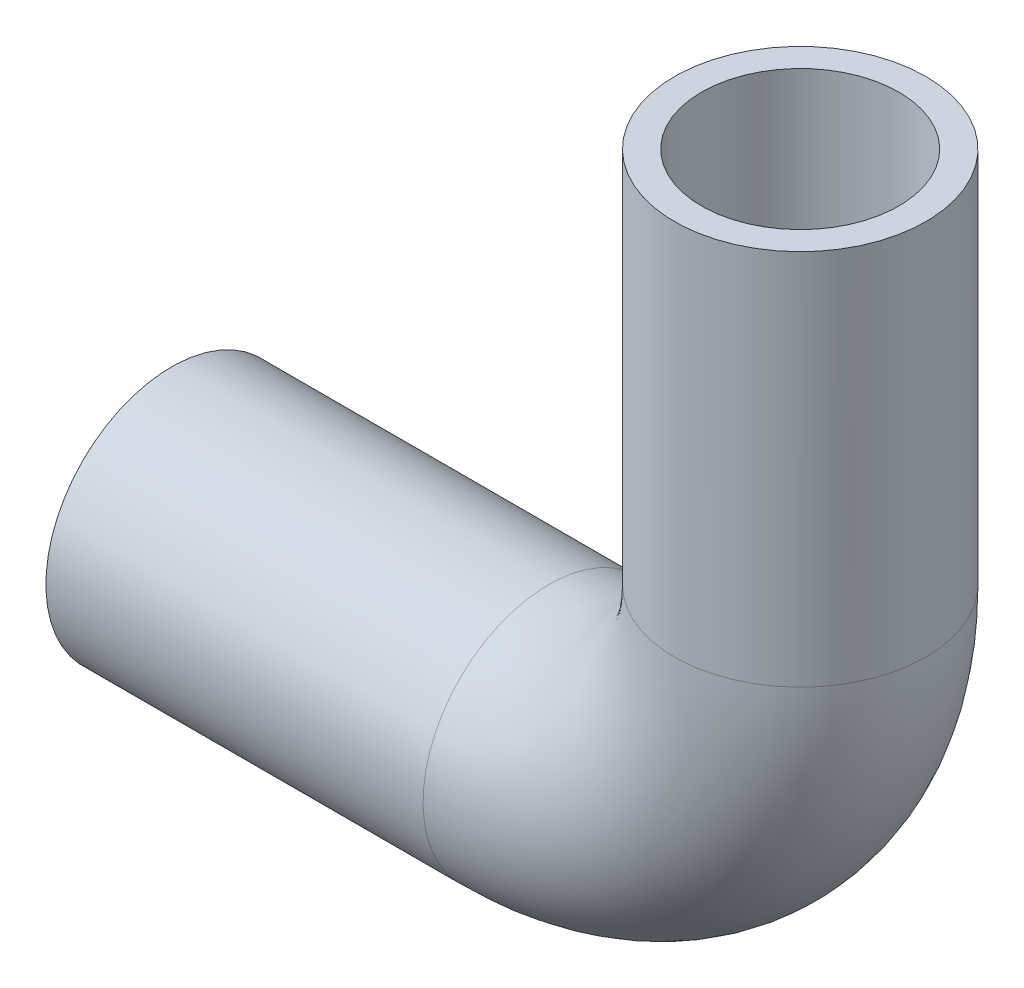
ISO-10303-21;
HEADER;
FILE_DESCRIPTION(('STEP AP214'),'2;1');
FILE_NAME('part.step','',(''),(''),'','','');
FILE_SCHEMA(('AUTOMOTIVE_DESIGN { 1 0 10303 214 1 1 1 1 }'));
ENDSEC;
DATA;
#1=APPLICATION_CONTEXT('core data for automotive mechanical design processes');
#2=APPLICATION_PROTOCOL_DEFINITION('international standard','automotive_design',2000,#1);
#3=PRODUCT_CONTEXT('',#1,'mechanical');
#4=PRODUCT('Part','Part','',(#3));
#5=PRODUCT_RELATED_PRODUCT_CATEGORY('part','',(#4));
#6=PRODUCT_DEFINITION_FORMATION('','',#4);
#7=PRODUCT_DEFINITION_CONTEXT('part definition',#1,'design');
#8=PRODUCT_DEFINITION('design','',#6,#7);
#9=PRODUCT_DEFINITION_SHAPE('','',#8);
#10=(LENGTH_UNIT() NAMED_UNIT(*) SI_UNIT(.MILLI.,.METRE.));
#11=(NAMED_UNIT(*) PLANE_ANGLE_UNIT() SI_UNIT($,.RADIAN.));
#12=(NAMED_UNIT(*) SI_UNIT($,.STERADIAN.) SOLID_ANGLE_UNIT());
#13=UNCERTAINTY_MEASURE_WITH_UNIT(LENGTH_MEASURE(1.E-05),#10,'distance_accuracy_value','');
#14=(GEOMETRIC_REPRESENTATION_CONTEXT(3) GLOBAL_UNCERTAINTY_ASSIGNED_CONTEXT((#13)) GLOBAL_UNIT_ASSIGNED_CONTEXT((#10,
#11,#12)) REPRESENTATION_CONTEXT('',''));
#15=CARTESIAN_POINT('',(0.,0.,0.));
#16=DIRECTION('',(0.,0.,1.));
#17=DIRECTION('',(1.,0.,0.));
#18=AXIS2_PLACEMENT_3D('',#15,#16,#17);
#19=CARTESIAN_POINT('',(0.,25.,0.));
#20=DIRECTION('',(0.,1.,0.));
#21=DIRECTION('',(0.,0.,-1.));
#22=AXIS2_PLACEMENT_3D('',#19,#20,#21);
#23=PLANE('',#22);
#24=CARTESIAN_POINT('',(0.,25.,0.));
#25=DIRECTION('',(0.,1.,0.));
#26=DIRECTION('',(0.,0.,-1.));
#27=AXIS2_PLACEMENT_3D('',#24,#25,#26);
#28=CIRCLE('',#27,5.);
#29=CARTESIAN_POINT('',(0.,25.,-5.));
#30=VERTEX_POINT('',#29);
#31=EDGE_CURVE('E10',#30,#30,#28,.T.);
#32=ORIENTED_EDGE('',*,*,#31,.T.);
#33=EDGE_LOOP('',(#32));
#34=FACE_BOUND('',#33,.T.);
#35=CARTESIAN_POINT('',(0.,25.,0.));
#36=DIRECTION('',(0.,1.,0.));
#37=DIRECTION('',(-1.,0.,0.));
#38=AXIS2_PLACEMENT_3D('',#35,#36,#37);
#39=CIRCLE('',#38,3.92459635643738);
#40=CARTESIAN_POINT('',(-3.92459635643739,24.9999999999999,0.));
#41=VERTEX_POINT('',#40);
#42=EDGE_CURVE('E34',#41,#41,#39,.F.);
#43=ORIENTED_EDGE('',*,*,#42,.T.);
#44=EDGE_LOOP('',(#43));
#45=FACE_BOUND('',#44,.T.);
#46=ADVANCED_FACE('F30',(#34,#45),#23,.T.);
#47=CARTESIAN_POINT('',(0.,10.0000000000001,0.));
#48=DIRECTION('',(0.,1.,0.));
#49=DIRECTION('',(-1.,0.,0.));
#50=AXIS2_PLACEMENT_3D('',#47,#48,#49);
#51=CYLINDRICAL_SURFACE('',#50,5.);
#52=CARTESIAN_POINT('',(0.,10.0000000000001,0.));
#53=DIRECTION('',(0.,1.,0.));
#54=DIRECTION('',(0.,0.,-1.));
#55=AXIS2_PLACEMENT_3D('',#52,#53,#54);
#56=CIRCLE('',#55,5.);
#57=CARTESIAN_POINT('',(5.,10.0000000000001,0.));
#58=VERTEX_POINT('',#57);
#59=EDGE_CURVE('E38',#58,#58,#56,.T.);
#60=ORIENTED_EDGE('',*,*,#59,.T.);
#61=EDGE_LOOP('',(#60));
#62=FACE_BOUND('',#61,.T.);
#63=ORIENTED_EDGE('',*,*,#31,.F.);
#64=EDGE_LOOP('',(#63));
#65=FACE_BOUND('',#64,.T.);
#66=ADVANCED_FACE('F32',(#62,#65),#51,.T.);
#67=CARTESIAN_POINT('',(-10.,10.,0.));
#68=DIRECTION('',(0.,0.,1.));
#69=DIRECTION('',(1.,0.,0.));
#70=AXIS2_PLACEMENT_3D('',#67,#68,#69);
#71=TOROIDAL_SURFACE('',#70,10.,5.);
#72=CARTESIAN_POINT('',(-10.0000000000001,0.,0.));
#73=DIRECTION('',(1.,0.,0.));
#74=DIRECTION('',(0.,0.,-1.));
#75=AXIS2_PLACEMENT_3D('',#72,#73,#74);
#76=CIRCLE('',#75,5.);
#77=CARTESIAN_POINT('',(-10.0000000000001,-5.,0.));
#78=VERTEX_POINT('',#77);
#79=EDGE_CURVE('E42',#78,#78,#76,.T.);
#80=CARTESIAN_POINT('',(-10.,10.,0.));
#81=DIRECTION('',(0.,0.,1.));
#82=DIRECTION('',(1.,0.,0.));
#83=AXIS2_PLACEMENT_3D('',#80,#81,#82);
#84=CIRCLE('',#83,15.);
#85=EDGE_CURVE('',#78,#58,#84,.T.);
#86=ORIENTED_EDGE('',*,*,#79,.T.);
#87=ORIENTED_EDGE('',*,*,#59,.F.);
#88=ORIENTED_EDGE('',*,*,#85,.T.);
#89=ORIENTED_EDGE('',*,*,#85,.F.);
#90=EDGE_LOOP('',(#86,#88,#87,#89));
#91=FACE_BOUND('',#90,.T.);
#92=ADVANCED_FACE('F78',(#91),#71,.T.);
#93=CARTESIAN_POINT('',(-10.0000000000001,0.,0.));
#94=DIRECTION('',(-1.,0.,0.));
#95=DIRECTION('',(0.,-1.,0.));
#96=AXIS2_PLACEMENT_3D('',#93,#94,#95);
#97=CYLINDRICAL_SURFACE('',#96,5.);
#98=ORIENTED_EDGE('',*,*,#79,.F.);
#99=EDGE_LOOP('',(#98));
#100=FACE_BOUND('',#99,.T.);
#101=CARTESIAN_POINT('',(-25.,0.,0.));
#102=DIRECTION('',(1.,0.,0.));
#103=DIRECTION('',(0.,0.,-1.));
#104=AXIS2_PLACEMENT_3D('',#101,#102,#103);
#105=CIRCLE('',#104,5.);
#106=CARTESIAN_POINT('',(-25.,0.,-5.));
#107=VERTEX_POINT('',#106);
#108=EDGE_CURVE('E45',#107,#107,#105,.T.);
#109=ORIENTED_EDGE('',*,*,#108,.T.);
#110=EDGE_LOOP('',(#109));
#111=FACE_BOUND('',#110,.T.);
#112=ADVANCED_FACE('F73',(#100,#111),#97,.T.);
#113=CARTESIAN_POINT('',(-25.,0.,0.));
#114=DIRECTION('',(1.,0.,0.));
#115=DIRECTION('',(0.,0.,-1.));
#116=AXIS2_PLACEMENT_3D('',#113,#114,#115);
#117=PLANE('',#116);
#118=CARTESIAN_POINT('',(-25.,0.,0.));
#119=DIRECTION('',(-1.,0.,0.));
#120=DIRECTION('',(0.,0.,1.));
#121=AXIS2_PLACEMENT_3D('',#118,#119,#120);
#122=CIRCLE('',#121,3.92459635643738);
#123=CARTESIAN_POINT('',(-25.,0.,3.92459635643738));
#124=VERTEX_POINT('',#123);
#125=EDGE_CURVE('E54',#124,#124,#122,.T.);
#126=ORIENTED_EDGE('',*,*,#125,.F.);
#127=EDGE_LOOP('',(#126));
#128=FACE_BOUND('',#127,.T.);
#129=ORIENTED_EDGE('',*,*,#108,.F.);
#130=EDGE_LOOP('',(#129));
#131=FACE_BOUND('',#130,.T.);
#132=ADVANCED_FACE('F69',(#128,#131),#117,.F.);
#133=CARTESIAN_POINT('',(0.,10.0000000000001,0.));
#134=DIRECTION('',(0.,1.,0.));
#135=DIRECTION('',(-1.,0.,0.));
#136=AXIS2_PLACEMENT_3D('',#133,#134,#135);
#137=CYLINDRICAL_SURFACE('',#136,3.92459635643738);
#138=ORIENTED_EDGE('',*,*,#42,.F.);
#139=EDGE_LOOP('',(#138));
#140=FACE_BOUND('',#139,.T.);
#141=CARTESIAN_POINT('',(0.,10.0000000000001,0.));
#142=DIRECTION('',(0.,-1.,0.));
#143=DIRECTION('',(0.,0.,1.));
#144=AXIS2_PLACEMENT_3D('',#141,#142,#143);
#145=CIRCLE('',#144,3.92459635643738);
#146=CARTESIAN_POINT('',(3.92459635643738,10.0000000000001,0.));
#147=VERTEX_POINT('',#146);
#148=EDGE_CURVE('E50',#147,#147,#145,.T.);
#149=ORIENTED_EDGE('',*,*,#148,.T.);
#150=EDGE_LOOP('',(#149));
#151=FACE_BOUND('',#150,.T.);
#152=ADVANCED_FACE('F72',(#140,#151),#137,.F.);
#153=CARTESIAN_POINT('',(-10.,10.,0.));
#154=DIRECTION('',(0.,0.,1.));
#155=DIRECTION('',(1.,0.,0.));
#156=AXIS2_PLACEMENT_3D('',#153,#154,#155);
#157=TOROIDAL_SURFACE('',#156,10.,3.92459635643738);
#158=CARTESIAN_POINT('',(-10.0000000000001,0.,0.));
#159=DIRECTION('',(-1.,0.,0.));
#160=DIRECTION('',(0.,0.,1.));
#161=AXIS2_PLACEMENT_3D('',#158,#159,#160);
#162=CIRCLE('',#161,3.92459635643738);
#163=CARTESIAN_POINT('',(-10.0000000000001,-3.92459635643739,0.));
#164=VERTEX_POINT('',#163);
#165=EDGE_CURVE('E53',#164,#164,#162,.T.);
#166=CARTESIAN_POINT('',(-10.,10.,0.));
#167=DIRECTION('',(0.,0.,1.));
#168=DIRECTION('',(1.,0.,0.));
#169=AXIS2_PLACEMENT_3D('',#166,#167,#168);
#170=CIRCLE('',#169,13.9245963564374);
#171=EDGE_CURVE('',#164,#147,#170,.T.);
#172=ORIENTED_EDGE('',*,*,#165,.T.);
#173=ORIENTED_EDGE('',*,*,#148,.F.);
#174=ORIENTED_EDGE('',*,*,#171,.T.);
#175=ORIENTED_EDGE('',*,*,#171,.F.);
#176=EDGE_LOOP('',(#172,#174,#173,#175));
#177=FACE_BOUND('',#176,.T.);
#178=ADVANCED_FACE('F60',(#177),#157,.F.);
#179=CARTESIAN_POINT('',(-10.0000000000001,0.,0.));
#180=DIRECTION('',(-1.,0.,0.));
#181=DIRECTION('',(0.,-1.,0.));
#182=AXIS2_PLACEMENT_3D('',#179,#180,#181);
#183=CYLINDRICAL_SURFACE('',#182,3.92459635643738);
#184=ORIENTED_EDGE('',*,*,#165,.F.);
#185=EDGE_LOOP('',(#184));
#186=FACE_BOUND('',#185,.T.);
#187=ORIENTED_EDGE('',*,*,#125,.T.);
#188=EDGE_LOOP('',(#187));
#189=FACE_BOUND('',#188,.T.);
#190=ADVANCED_FACE('F63',(#186,#189),#183,.F.);
#191=CLOSED_SHELL('',(#46,#66,#92,#112,#132,#152,#178,#190));
#192=MANIFOLD_SOLID_BREP('B2',#191);
#193=ADVANCED_BREP_SHAPE_REPRESENTATION('',(#18,#192),#14);
#194=SHAPE_DEFINITION_REPRESENTATION(#9,#193);
ENDSEC;
END-ISO-10303-21;
